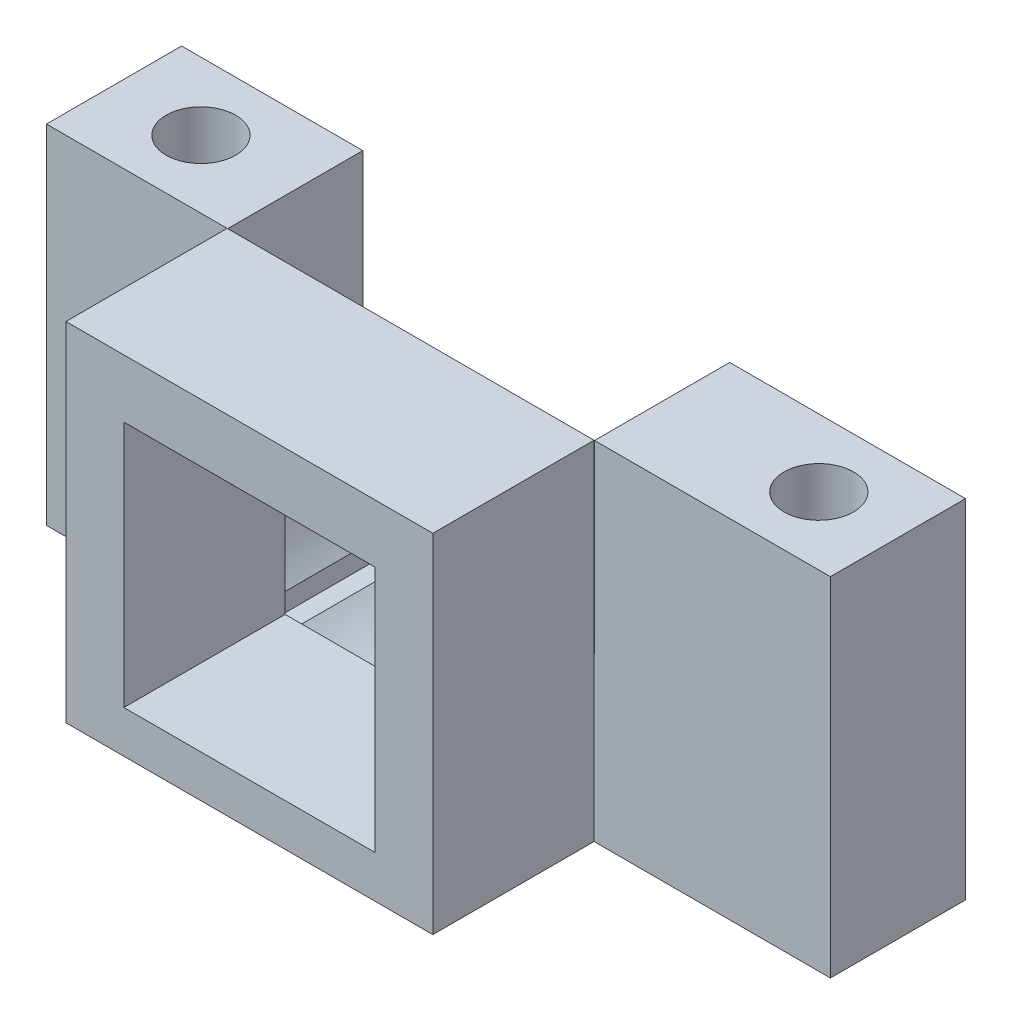
ISO-10303-21;
HEADER;
FILE_DESCRIPTION(('STEP AP214'),'2;1');
FILE_NAME('part.step','',(''),(''),'','','');
FILE_SCHEMA(('AUTOMOTIVE_DESIGN { 1 0 10303 214 1 1 1 1 }'));
ENDSEC;
DATA;
#1=APPLICATION_CONTEXT('core data for automotive mechanical design processes');
#2=APPLICATION_PROTOCOL_DEFINITION('international standard','automotive_design',2000,#1);
#3=PRODUCT_CONTEXT('',#1,'mechanical');
#4=PRODUCT('Part','Part','',(#3));
#5=PRODUCT_RELATED_PRODUCT_CATEGORY('part','',(#4));
#6=PRODUCT_DEFINITION_FORMATION('','',#4);
#7=PRODUCT_DEFINITION_CONTEXT('part definition',#1,'design');
#8=PRODUCT_DEFINITION('design','',#6,#7);
#9=PRODUCT_DEFINITION_SHAPE('','',#8);
#10=(LENGTH_UNIT() NAMED_UNIT(*) SI_UNIT(.MILLI.,.METRE.));
#11=(NAMED_UNIT(*) PLANE_ANGLE_UNIT() SI_UNIT($,.RADIAN.));
#12=(NAMED_UNIT(*) SI_UNIT($,.STERADIAN.) SOLID_ANGLE_UNIT());
#13=UNCERTAINTY_MEASURE_WITH_UNIT(LENGTH_MEASURE(1.E-05),#10,'distance_accuracy_value','');
#14=(GEOMETRIC_REPRESENTATION_CONTEXT(3) GLOBAL_UNCERTAINTY_ASSIGNED_CONTEXT((#13)) GLOBAL_UNIT_ASSIGNED_CONTEXT((#10,
#11,#12)) REPRESENTATION_CONTEXT('',''));
#15=CARTESIAN_POINT('',(0.,0.,0.));
#16=DIRECTION('',(0.,0.,1.));
#17=DIRECTION('',(1.,0.,0.));
#18=AXIS2_PLACEMENT_3D('',#15,#16,#17);
#19=CARTESIAN_POINT('',(18.3887402922752,10.3631468182852,7.));
#20=DIRECTION('',(0.,0.,-1.));
#21=DIRECTION('',(-1.,0.,0.));
#22=AXIS2_PLACEMENT_3D('',#19,#20,#21);
#23=CYLINDRICAL_SURFACE('',#22,8.75000000000001);
#24=CARTESIAN_POINT('',(18.3887402922752,10.3631468182852,0.));
#25=DIRECTION('',(0.,0.,1.));
#26=DIRECTION('',(1.,0.,0.));
#27=AXIS2_PLACEMENT_3D('',#24,#25,#26);
#28=CIRCLE('',#27,8.75000000000001);
#29=CARTESIAN_POINT('',(9.64212979628884,10.1196209849502,0.));
#30=VERTEX_POINT('',#29);
#31=CARTESIAN_POINT('',(11.6843212547284,4.7405793114446,0.));
#32=VERTEX_POINT('',#31);
#33=EDGE_CURVE('E292',#30,#32,#28,.T.);
#34=ORIENTED_EDGE('',*,*,#33,.F.);
#35=DIRECTION('',(0.,0.,-1.));
#36=VECTOR('',#35,1.);
#37=CARTESIAN_POINT('',(9.64212979628884,10.1196209849502,7.));
#38=LINE('',#37,#36);
#39=CARTESIAN_POINT('',(9.64212979628884,10.1196209849502,7.));
#40=VERTEX_POINT('',#39);
#41=EDGE_CURVE('E11',#40,#30,#38,.T.);
#42=ORIENTED_EDGE('',*,*,#41,.F.);
#43=CARTESIAN_POINT('',(18.3887402922752,10.3631468182852,7.));
#44=DIRECTION('',(0.,0.,1.));
#45=DIRECTION('',(1.,0.,0.));
#46=AXIS2_PLACEMENT_3D('',#43,#44,#45);
#47=CIRCLE('',#46,8.75000000000001);
#48=CARTESIAN_POINT('',(11.6843212547284,4.7405793114446,7.));
#49=VERTEX_POINT('',#48);
#50=EDGE_CURVE('E293',#40,#49,#47,.T.);
#51=ORIENTED_EDGE('',*,*,#50,.T.);
#52=DIRECTION('',(0.,0.,-1.));
#53=VECTOR('',#52,1.);
#54=CARTESIAN_POINT('',(11.6843212547284,4.7405793114446,7.));
#55=LINE('',#54,#53);
#56=EDGE_CURVE('E324',#49,#32,#55,.T.);
#57=ORIENTED_EDGE('',*,*,#56,.T.);
#58=EDGE_LOOP('',(#34,#42,#51,#57));
#59=FACE_BOUND('',#58,.T.);
#60=ADVANCED_FACE('F47',(#59),#23,.F.);
#61=CARTESIAN_POINT('',(0.,10.1196209849502,7.));
#62=DIRECTION('',(0.,1.,0.));
#63=DIRECTION('',(0.,0.,1.));
#64=AXIS2_PLACEMENT_3D('',#61,#62,#63);
#65=PLANE('',#64);
#66=DIRECTION('',(1.,0.,0.));
#67=VECTOR('',#66,1.);
#68=CARTESIAN_POINT('',(0.,10.1196209849502,0.));
#69=LINE('',#68,#67);
#70=CARTESIAN_POINT('',(8.88432125472841,10.1196209849502,0.));
#71=VERTEX_POINT('',#70);
#72=EDGE_CURVE('E328',#71,#30,#69,.T.);
#73=ORIENTED_EDGE('',*,*,#72,.F.);
#74=DIRECTION('',(0.,0.,-1.));
#75=VECTOR('',#74,1.);
#76=CARTESIAN_POINT('',(8.88432125472841,10.1196209849502,7.));
#77=LINE('',#76,#75);
#78=CARTESIAN_POINT('',(8.88432125472841,10.1196209849502,7.));
#79=VERTEX_POINT('',#78);
#80=EDGE_CURVE('E56',#79,#71,#77,.T.);
#81=ORIENTED_EDGE('',*,*,#80,.F.);
#82=DIRECTION('',(1.,0.,0.));
#83=VECTOR('',#82,1.);
#84=CARTESIAN_POINT('',(0.,10.1196209849502,7.));
#85=LINE('',#84,#83);
#86=EDGE_CURVE('E297',#79,#40,#85,.T.);
#87=ORIENTED_EDGE('',*,*,#86,.T.);
#88=ORIENTED_EDGE('',*,*,#41,.T.);
#89=EDGE_LOOP('',(#73,#81,#87,#88));
#90=FACE_BOUND('',#89,.T.);
#91=ADVANCED_FACE('F49',(#90),#65,.T.);
#92=CARTESIAN_POINT('',(8.88432125472841,0.,7.));
#93=DIRECTION('',(1.,0.,0.));
#94=DIRECTION('',(0.,0.,-1.));
#95=AXIS2_PLACEMENT_3D('',#92,#93,#94);
#96=PLANE('',#95);
#97=DIRECTION('',(0.,-1.,0.));
#98=VECTOR('',#97,1.);
#99=CARTESIAN_POINT('',(8.88432125472841,0.,0.));
#100=LINE('',#99,#98);
#101=CARTESIAN_POINT('',(8.88432125472841,19.7,0.));
#102=VERTEX_POINT('',#101);
#103=EDGE_CURVE('E333',#102,#71,#100,.T.);
#104=ORIENTED_EDGE('',*,*,#103,.F.);
#105=DIRECTION('',(0.,0.,-1.));
#106=VECTOR('',#105,1.);
#107=CARTESIAN_POINT('',(8.88432125472841,19.7,7.));
#108=LINE('',#107,#106);
#109=CARTESIAN_POINT('',(8.88432125472841,19.7,7.));
#110=VERTEX_POINT('',#109);
#111=EDGE_CURVE('E371',#110,#102,#108,.T.);
#112=ORIENTED_EDGE('',*,*,#111,.F.);
#113=DIRECTION('',(0.,-1.,0.));
#114=VECTOR('',#113,1.);
#115=CARTESIAN_POINT('',(8.88432125472841,0.,7.));
#116=LINE('',#115,#114);
#117=EDGE_CURVE('E303',#110,#79,#116,.T.);
#118=ORIENTED_EDGE('',*,*,#117,.T.);
#119=ORIENTED_EDGE('',*,*,#80,.T.);
#120=EDGE_LOOP('',(#104,#112,#118,#119));
#121=FACE_BOUND('',#120,.T.);
#122=ADVANCED_FACE('F377',(#121),#96,.T.);
#123=CARTESIAN_POINT('',(0.,19.7,7.));
#124=DIRECTION('',(0.,1.,0.));
#125=DIRECTION('',(0.,0.,1.));
#126=AXIS2_PLACEMENT_3D('',#123,#124,#125);
#127=PLANE('',#126);
#128=CARTESIAN_POINT('',(4.,19.7,3.5));
#129=DIRECTION('',(0.,1.,0.));
#130=DIRECTION('',(0.,0.,1.));
#131=AXIS2_PLACEMENT_3D('',#128,#129,#130);
#132=CIRCLE('',#131,1.8);
#133=CARTESIAN_POINT('',(4.,19.7,5.3));
#134=VERTEX_POINT('',#133);
#135=EDGE_CURVE('E544',#134,#134,#132,.T.);
#136=ORIENTED_EDGE('',*,*,#135,.F.);
#137=EDGE_LOOP('',(#136));
#138=FACE_BOUND('',#137,.T.);
#139=DIRECTION('',(1.,0.,0.));
#140=VECTOR('',#139,1.);
#141=CARTESIAN_POINT('',(0.,19.7,0.));
#142=LINE('',#141,#140);
#143=CARTESIAN_POINT('',(-0.5,19.7,0.));
#144=VERTEX_POINT('',#143);
#145=EDGE_CURVE('E337',#144,#102,#142,.T.);
#146=ORIENTED_EDGE('',*,*,#145,.F.);
#147=DIRECTION('',(0.,0.,-1.));
#148=VECTOR('',#147,1.);
#149=CARTESIAN_POINT('',(-0.5,19.7,7.));
#150=LINE('',#149,#148);
#151=CARTESIAN_POINT('',(-0.5,19.7,7.));
#152=VERTEX_POINT('',#151);
#153=EDGE_CURVE('E368',#152,#144,#150,.T.);
#154=ORIENTED_EDGE('',*,*,#153,.F.);
#155=DIRECTION('',(1.,0.,0.));
#156=VECTOR('',#155,1.);
#157=CARTESIAN_POINT('',(0.,19.7,7.));
#158=LINE('',#157,#156);
#159=CARTESIAN_POINT('',(8.86,19.7,7.));
#160=VERTEX_POINT('',#159);
#161=EDGE_CURVE('E307',#152,#160,#158,.T.);
#162=ORIENTED_EDGE('',*,*,#161,.T.);
#163=DIRECTION('',(0.,0.,-1.));
#164=VECTOR('',#163,1.);
#165=CARTESIAN_POINT('',(8.86,19.7,15.35));
#166=LINE('',#165,#164);
#167=CARTESIAN_POINT('',(8.86,19.7,15.35));
#168=VERTEX_POINT('',#167);
#169=EDGE_CURVE('E275',#168,#160,#166,.T.);
#170=ORIENTED_EDGE('',*,*,#169,.F.);
#171=DIRECTION('',(-1.,0.,0.));
#172=VECTOR('',#171,1.);
#173=CARTESIAN_POINT('',(8.86,19.7,15.35));
#174=LINE('',#173,#172);
#175=CARTESIAN_POINT('',(27.8603974424949,19.7,15.35));
#176=VERTEX_POINT('',#175);
#177=EDGE_CURVE('E280',#176,#168,#174,.T.);
#178=ORIENTED_EDGE('',*,*,#177,.F.);
#179=DIRECTION('',(0.,0.,-1.));
#180=VECTOR('',#179,1.);
#181=CARTESIAN_POINT('',(27.8603974424949,19.7,15.35));
#182=LINE('',#181,#180);
#183=CARTESIAN_POINT('',(27.8603974424949,19.7,7.));
#184=VERTEX_POINT('',#183);
#185=EDGE_CURVE('E279',#176,#184,#182,.T.);
#186=ORIENTED_EDGE('',*,*,#185,.T.);
#187=DIRECTION('',(-1.,0.,0.));
#188=VECTOR('',#187,1.);
#189=CARTESIAN_POINT('',(8.86,19.7,7.));
#190=LINE('',#189,#188);
#191=EDGE_CURVE('E270',#184,#110,#190,.T.);
#192=ORIENTED_EDGE('',*,*,#191,.T.);
#193=ORIENTED_EDGE('',*,*,#111,.T.);
#194=EDGE_LOOP('',(#146,#154,#162,#170,#178,#186,#192,#193));
#195=FACE_BOUND('',#194,.T.);
#196=ADVANCED_FACE('F388',(#138,#195),#127,.T.);
#197=CARTESIAN_POINT('',(-0.5,0.,7.));
#198=DIRECTION('',(1.,0.,0.));
#199=DIRECTION('',(0.,0.,-1.));
#200=AXIS2_PLACEMENT_3D('',#197,#198,#199);
#201=PLANE('',#200);
#202=DIRECTION('',(0.,-1.,0.));
#203=VECTOR('',#202,1.);
#204=CARTESIAN_POINT('',(-0.5,0.,0.));
#205=LINE('',#204,#203);
#206=CARTESIAN_POINT('',(-0.5,1.7,0.));
#207=VERTEX_POINT('',#206);
#208=EDGE_CURVE('E341',#144,#207,#205,.T.);
#209=ORIENTED_EDGE('',*,*,#208,.T.);
#210=DIRECTION('',(0.,0.,-1.));
#211=VECTOR('',#210,1.);
#212=CARTESIAN_POINT('',(-0.5,1.7,7.));
#213=LINE('',#212,#211);
#214=CARTESIAN_POINT('',(-0.5,1.7,7.));
#215=VERTEX_POINT('',#214);
#216=EDGE_CURVE('E364',#215,#207,#213,.T.);
#217=ORIENTED_EDGE('',*,*,#216,.F.);
#218=DIRECTION('',(0.,-1.,0.));
#219=VECTOR('',#218,1.);
#220=CARTESIAN_POINT('',(-0.5,0.,7.));
#221=LINE('',#220,#219);
#222=EDGE_CURVE('E310',#152,#215,#221,.T.);
#223=ORIENTED_EDGE('',*,*,#222,.F.);
#224=ORIENTED_EDGE('',*,*,#153,.T.);
#225=EDGE_LOOP('',(#209,#217,#223,#224));
#226=FACE_BOUND('',#225,.T.);
#227=ADVANCED_FACE('F562',(#226),#201,.F.);
#228=CARTESIAN_POINT('',(0.,1.7,7.));
#229=DIRECTION('',(0.,1.,0.));
#230=DIRECTION('',(-1.,0.,0.));
#231=AXIS2_PLACEMENT_3D('',#228,#229,#230);
#232=PLANE('',#231);
#233=CARTESIAN_POINT('',(4.,1.7,3.5));
#234=DIRECTION('',(0.,1.,0.));
#235=DIRECTION('',(0.,0.,1.));
#236=AXIS2_PLACEMENT_3D('',#233,#234,#235);
#237=CIRCLE('',#236,1.8);
#238=CARTESIAN_POINT('',(4.,1.7,5.3));
#239=VERTEX_POINT('',#238);
#240=EDGE_CURVE('E513',#239,#239,#237,.T.);
#241=ORIENTED_EDGE('',*,*,#240,.T.);
#242=EDGE_LOOP('',(#241));
#243=FACE_BOUND('',#242,.T.);
#244=CARTESIAN_POINT('',(36.,1.7,3.5));
#245=DIRECTION('',(0.,1.,0.));
#246=DIRECTION('',(0.,0.,1.));
#247=AXIS2_PLACEMENT_3D('',#244,#245,#246);
#248=CIRCLE('',#247,1.8);
#249=CARTESIAN_POINT('',(36.,1.7,5.3));
#250=VERTEX_POINT('',#249);
#251=EDGE_CURVE('E536',#250,#250,#248,.T.);
#252=ORIENTED_EDGE('',*,*,#251,.T.);
#253=EDGE_LOOP('',(#252));
#254=FACE_BOUND('',#253,.T.);
#255=DIRECTION('',(1.,0.,0.));
#256=VECTOR('',#255,1.);
#257=CARTESIAN_POINT('',(0.,1.7,0.));
#258=LINE('',#257,#256);
#259=CARTESIAN_POINT('',(17.1589487632613,1.7,0.));
#260=VERTEX_POINT('',#259);
#261=EDGE_CURVE('E344',#207,#260,#258,.T.);
#262=ORIENTED_EDGE('',*,*,#261,.T.);
#263=DIRECTION('',(0.,0.,-1.));
#264=VECTOR('',#263,1.);
#265=CARTESIAN_POINT('',(17.1589487632613,1.7,7.));
#266=LINE('',#265,#264);
#267=CARTESIAN_POINT('',(17.1589487632613,1.7,7.));
#268=VERTEX_POINT('',#267);
#269=EDGE_CURVE('E255',#268,#260,#266,.T.);
#270=ORIENTED_EDGE('',*,*,#269,.F.);
#271=DIRECTION('',(1.,0.,0.));
#272=VECTOR('',#271,1.);
#273=CARTESIAN_POINT('',(8.86,1.70000000000001,7.));
#274=LINE('',#273,#272);
#275=CARTESIAN_POINT('',(19.6185318212891,1.7,7.));
#276=VERTEX_POINT('',#275);
#277=EDGE_CURVE('E244',#268,#276,#274,.T.);
#278=ORIENTED_EDGE('',*,*,#277,.T.);
#279=DIRECTION('',(0.,0.,-1.));
#280=VECTOR('',#279,1.);
#281=CARTESIAN_POINT('',(19.6185318212891,1.7,7.));
#282=LINE('',#281,#280);
#283=CARTESIAN_POINT('',(19.6185318212891,1.7,0.));
#284=VERTEX_POINT('',#283);
#285=EDGE_CURVE('E224',#276,#284,#282,.T.);
#286=ORIENTED_EDGE('',*,*,#285,.T.);
#287=DIRECTION('',(1.,0.,0.));
#288=VECTOR('',#287,1.);
#289=CARTESIAN_POINT('',(0.,1.7,0.));
#290=LINE('',#289,#288);
#291=CARTESIAN_POINT('',(40.1,1.7,0.));
#292=VERTEX_POINT('',#291);
#293=EDGE_CURVE('E508',#284,#292,#290,.T.);
#294=ORIENTED_EDGE('',*,*,#293,.T.);
#295=DIRECTION('',(0.,0.,-1.));
#296=VECTOR('',#295,1.);
#297=CARTESIAN_POINT('',(40.1,1.7,7.));
#298=LINE('',#297,#296);
#299=CARTESIAN_POINT('',(40.1,1.7,7.));
#300=VERTEX_POINT('',#299);
#301=EDGE_CURVE('E237',#300,#292,#298,.T.);
#302=ORIENTED_EDGE('',*,*,#301,.F.);
#303=DIRECTION('',(1.,0.,0.));
#304=VECTOR('',#303,1.);
#305=CARTESIAN_POINT('',(0.,1.7,7.));
#306=LINE('',#305,#304);
#307=CARTESIAN_POINT('',(27.8603974424949,1.7,7.));
#308=VERTEX_POINT('',#307);
#309=EDGE_CURVE('E249',#308,#300,#306,.T.);
#310=ORIENTED_EDGE('',*,*,#309,.F.);
#311=DIRECTION('',(0.,0.,-1.));
#312=VECTOR('',#311,1.);
#313=CARTESIAN_POINT('',(27.8603974424949,1.70000000000001,15.35));
#314=LINE('',#313,#312);
#315=CARTESIAN_POINT('',(27.8603974424949,1.70000000000001,15.35));
#316=VERTEX_POINT('',#315);
#317=EDGE_CURVE('E284',#316,#308,#314,.T.);
#318=ORIENTED_EDGE('',*,*,#317,.F.);
#319=DIRECTION('',(1.,0.,0.));
#320=VECTOR('',#319,1.);
#321=CARTESIAN_POINT('',(8.86,1.70000000000001,15.35));
#322=LINE('',#321,#320);
#323=CARTESIAN_POINT('',(8.86,1.70000000000001,15.35));
#324=VERTEX_POINT('',#323);
#325=EDGE_CURVE('E410',#324,#316,#322,.T.);
#326=ORIENTED_EDGE('',*,*,#325,.F.);
#327=DIRECTION('',(0.,0.,-1.));
#328=VECTOR('',#327,1.);
#329=CARTESIAN_POINT('',(8.86,1.70000000000001,15.35));
#330=LINE('',#329,#328);
#331=CARTESIAN_POINT('',(8.86,1.70000000000001,7.));
#332=VERTEX_POINT('',#331);
#333=EDGE_CURVE('E288',#324,#332,#330,.T.);
#334=ORIENTED_EDGE('',*,*,#333,.T.);
#335=DIRECTION('',(1.,0.,0.));
#336=VECTOR('',#335,1.);
#337=CARTESIAN_POINT('',(0.,1.7,7.));
#338=LINE('',#337,#336);
#339=EDGE_CURVE('E313',#215,#332,#338,.T.);
#340=ORIENTED_EDGE('',*,*,#339,.F.);
#341=ORIENTED_EDGE('',*,*,#216,.T.);
#342=EDGE_LOOP('',(#262,#270,#278,#286,#294,#302,#310,#318,#326,#334,#340,#341));
#343=FACE_BOUND('',#342,.T.);
#344=ADVANCED_FACE('F254',(#243,#254,#343),#232,.F.);
#345=CARTESIAN_POINT('',(12.6181265718274,3.78572199626109,0.));
#346=VERTEX_POINT('',#345);
#347=EDGE_CURVE('E329',#346,#260,#28,.T.);
#348=ORIENTED_EDGE('',*,*,#347,.F.);
#349=DIRECTION('',(0.,0.,-1.));
#350=VECTOR('',#349,1.);
#351=CARTESIAN_POINT('',(12.6181265718274,3.78572199626109,7.));
#352=LINE('',#351,#350);
#353=CARTESIAN_POINT('',(12.6181265718274,3.78572199626109,7.));
#354=VERTEX_POINT('',#353);
#355=EDGE_CURVE('E359',#354,#346,#352,.T.);
#356=ORIENTED_EDGE('',*,*,#355,.F.);
#357=EDGE_CURVE('E299',#354,#268,#47,.T.);
#358=ORIENTED_EDGE('',*,*,#357,.T.);
#359=ORIENTED_EDGE('',*,*,#269,.T.);
#360=EDGE_LOOP('',(#348,#356,#358,#359));
#361=FACE_BOUND('',#360,.T.);
#362=ADVANCED_FACE('F574',(#361),#23,.F.);
#363=CARTESIAN_POINT('',(0.,3.78572199626109,7.));
#364=DIRECTION('',(0.,1.,0.));
#365=DIRECTION('',(0.,0.,1.));
#366=AXIS2_PLACEMENT_3D('',#363,#364,#365);
#367=PLANE('',#366);
#368=DIRECTION('',(1.,0.,0.));
#369=VECTOR('',#368,1.);
#370=CARTESIAN_POINT('',(0.,3.78572199626109,0.));
#371=LINE('',#370,#369);
#372=CARTESIAN_POINT('',(11.6843212547284,3.78572199626109,0.));
#373=VERTEX_POINT('',#372);
#374=EDGE_CURVE('E347',#373,#346,#371,.T.);
#375=ORIENTED_EDGE('',*,*,#374,.F.);
#376=DIRECTION('',(0.,0.,-1.));
#377=VECTOR('',#376,1.);
#378=CARTESIAN_POINT('',(11.6843212547284,3.78572199626109,7.));
#379=LINE('',#378,#377);
#380=CARTESIAN_POINT('',(11.6843212547284,3.78572199626109,7.));
#381=VERTEX_POINT('',#380);
#382=EDGE_CURVE('E356',#381,#373,#379,.T.);
#383=ORIENTED_EDGE('',*,*,#382,.F.);
#384=DIRECTION('',(1.,0.,0.));
#385=VECTOR('',#384,1.);
#386=CARTESIAN_POINT('',(0.,3.78572199626109,7.));
#387=LINE('',#386,#385);
#388=EDGE_CURVE('E316',#381,#354,#387,.T.);
#389=ORIENTED_EDGE('',*,*,#388,.T.);
#390=ORIENTED_EDGE('',*,*,#355,.T.);
#391=EDGE_LOOP('',(#375,#383,#389,#390));
#392=FACE_BOUND('',#391,.T.);
#393=ADVANCED_FACE('F401',(#392),#367,.T.);
#394=CARTESIAN_POINT('',(11.6843212547284,0.,7.));
#395=DIRECTION('',(1.,0.,0.));
#396=DIRECTION('',(0.,0.,-1.));
#397=AXIS2_PLACEMENT_3D('',#394,#395,#396);
#398=PLANE('',#397);
#399=DIRECTION('',(0.,-1.,0.));
#400=VECTOR('',#399,1.);
#401=CARTESIAN_POINT('',(11.6843212547284,0.,0.));
#402=LINE('',#401,#400);
#403=EDGE_CURVE('E298',#32,#373,#402,.T.);
#404=ORIENTED_EDGE('',*,*,#403,.F.);
#405=ORIENTED_EDGE('',*,*,#56,.F.);
#406=DIRECTION('',(0.,-1.,0.));
#407=VECTOR('',#406,1.);
#408=CARTESIAN_POINT('',(11.6843212547284,0.,7.));
#409=LINE('',#408,#407);
#410=EDGE_CURVE('E320',#49,#381,#409,.T.);
#411=ORIENTED_EDGE('',*,*,#410,.T.);
#412=ORIENTED_EDGE('',*,*,#382,.T.);
#413=EDGE_LOOP('',(#404,#405,#411,#412));
#414=FACE_BOUND('',#413,.T.);
#415=ADVANCED_FACE('F398',(#414),#398,.T.);
#416=CARTESIAN_POINT('',(0.,0.,7.));
#417=DIRECTION('',(0.,0.,1.));
#418=DIRECTION('',(1.,0.,0.));
#419=AXIS2_PLACEMENT_3D('',#416,#417,#418);
#420=PLANE('',#419);
#421=DIRECTION('',(0.,-1.,0.));
#422=VECTOR('',#421,1.);
#423=CARTESIAN_POINT('',(8.86,19.7,7.));
#424=LINE('',#423,#422);
#425=EDGE_CURVE('E71',#160,#332,#424,.T.);
#426=ORIENTED_EDGE('',*,*,#425,.F.);
#427=ORIENTED_EDGE('',*,*,#161,.F.);
#428=ORIENTED_EDGE('',*,*,#222,.T.);
#429=ORIENTED_EDGE('',*,*,#339,.T.);
#430=EDGE_LOOP('',(#426,#427,#428,#429));
#431=FACE_BOUND('',#430,.T.);
#432=ADVANCED_FACE('F772',(#431),#420,.T.);
#433=CARTESIAN_POINT('',(0.,0.,0.));
#434=DIRECTION('',(0.,0.,1.));
#435=DIRECTION('',(1.,0.,0.));
#436=AXIS2_PLACEMENT_3D('',#433,#434,#435);
#437=PLANE('',#436);
#438=ORIENTED_EDGE('',*,*,#33,.T.);
#439=ORIENTED_EDGE('',*,*,#403,.T.);
#440=ORIENTED_EDGE('',*,*,#374,.T.);
#441=ORIENTED_EDGE('',*,*,#347,.T.);
#442=ORIENTED_EDGE('',*,*,#261,.F.);
#443=ORIENTED_EDGE('',*,*,#208,.F.);
#444=ORIENTED_EDGE('',*,*,#145,.T.);
#445=ORIENTED_EDGE('',*,*,#103,.T.);
#446=ORIENTED_EDGE('',*,*,#72,.T.);
#447=EDGE_LOOP('',(#438,#439,#440,#441,#442,#443,#444,#445,#446));
#448=FACE_BOUND('',#447,.T.);
#449=ADVANCED_FACE('F383',(#448),#437,.F.);
#450=CARTESIAN_POINT('',(0.,0.,15.35));
#451=DIRECTION('',(0.,0.,1.));
#452=DIRECTION('',(1.,0.,0.));
#453=AXIS2_PLACEMENT_3D('',#450,#451,#452);
#454=PLANE('',#453);
#455=DIRECTION('',(0.,-1.,0.));
#456=VECTOR('',#455,1.);
#457=CARTESIAN_POINT('',(8.86,19.7,15.35));
#458=LINE('',#457,#456);
#459=EDGE_CURVE('E274',#168,#324,#458,.T.);
#460=ORIENTED_EDGE('',*,*,#459,.T.);
#461=ORIENTED_EDGE('',*,*,#325,.T.);
#462=DIRECTION('',(0.,1.,0.));
#463=VECTOR('',#462,1.);
#464=CARTESIAN_POINT('',(27.8603974424949,19.7,15.35));
#465=LINE('',#464,#463);
#466=EDGE_CURVE('E408',#316,#176,#465,.T.);
#467=ORIENTED_EDGE('',*,*,#466,.T.);
#468=ORIENTED_EDGE('',*,*,#177,.T.);
#469=EDGE_LOOP('',(#460,#461,#467,#468));
#470=FACE_BOUND('',#469,.T.);
#471=DIRECTION('',(1.,0.,0.));
#472=VECTOR('',#471,1.);
#473=CARTESIAN_POINT('',(11.8603974424954,3.88746318309419,15.35));
#474=LINE('',#473,#472);
#475=CARTESIAN_POINT('',(11.8603974424954,3.88746318309419,15.35));
#476=VERTEX_POINT('',#475);
#477=CARTESIAN_POINT('',(24.8603974424949,3.88746318309419,15.35));
#478=VERTEX_POINT('',#477);
#479=EDGE_CURVE('E456',#476,#478,#474,.T.);
#480=ORIENTED_EDGE('',*,*,#479,.F.);
#481=DIRECTION('',(0.,-1.,0.));
#482=VECTOR('',#481,1.);
#483=CARTESIAN_POINT('',(11.8603974424954,16.6874631830942,15.35));
#484=LINE('',#483,#482);
#485=CARTESIAN_POINT('',(11.8603974424954,16.6874631830942,15.35));
#486=VERTEX_POINT('',#485);
#487=EDGE_CURVE('E438',#486,#476,#484,.T.);
#488=ORIENTED_EDGE('',*,*,#487,.F.);
#489=DIRECTION('',(-1.,0.,0.));
#490=VECTOR('',#489,1.);
#491=CARTESIAN_POINT('',(11.8603974424954,16.6874631830942,15.35));
#492=LINE('',#491,#490);
#493=CARTESIAN_POINT('',(24.8603974424949,16.6874631830942,15.35));
#494=VERTEX_POINT('',#493);
#495=EDGE_CURVE('E433',#494,#486,#492,.T.);
#496=ORIENTED_EDGE('',*,*,#495,.F.);
#497=DIRECTION('',(0.,1.,0.));
#498=VECTOR('',#497,1.);
#499=CARTESIAN_POINT('',(24.8603974424949,16.6874631830942,15.35));
#500=LINE('',#499,#498);
#501=EDGE_CURVE('E452',#478,#494,#500,.T.);
#502=ORIENTED_EDGE('',*,*,#501,.F.);
#503=EDGE_LOOP('',(#480,#488,#496,#502));
#504=FACE_BOUND('',#503,.T.);
#505=ADVANCED_FACE('F679',(#470,#504),#454,.T.);
#506=CARTESIAN_POINT('',(0.,0.,7.));
#507=DIRECTION('',(0.,0.,1.));
#508=DIRECTION('',(1.,0.,0.));
#509=AXIS2_PLACEMENT_3D('',#506,#507,#508);
#510=PLANE('',#509);
#511=DIRECTION('',(1.,0.,0.));
#512=VECTOR('',#511,1.);
#513=CARTESIAN_POINT('',(0.,3.78572199626109,7.));
#514=LINE('',#513,#512);
#515=CARTESIAN_POINT('',(24.159354012723,3.78572199626109,7.));
#516=VERTEX_POINT('',#515);
#517=CARTESIAN_POINT('',(25.0843212547284,3.78572199626109,7.));
#518=VERTEX_POINT('',#517);
#519=EDGE_CURVE('E247',#516,#518,#514,.T.);
#520=ORIENTED_EDGE('',*,*,#519,.F.);
#521=CARTESIAN_POINT('',(18.3887402922752,10.3631468182852,7.));
#522=DIRECTION('',(0.,0.,1.));
#523=DIRECTION('',(1.,0.,0.));
#524=AXIS2_PLACEMENT_3D('',#521,#522,#523);
#525=CIRCLE('',#524,8.75000000000001);
#526=EDGE_CURVE('E227',#276,#516,#525,.T.);
#527=ORIENTED_EDGE('',*,*,#526,.F.);
#528=ORIENTED_EDGE('',*,*,#277,.F.);
#529=ORIENTED_EDGE('',*,*,#357,.F.);
#530=ORIENTED_EDGE('',*,*,#388,.F.);
#531=ORIENTED_EDGE('',*,*,#410,.F.);
#532=ORIENTED_EDGE('',*,*,#50,.F.);
#533=ORIENTED_EDGE('',*,*,#86,.F.);
#534=ORIENTED_EDGE('',*,*,#117,.F.);
#535=ORIENTED_EDGE('',*,*,#191,.F.);
#536=DIRECTION('',(0.,1.,0.));
#537=VECTOR('',#536,1.);
#538=CARTESIAN_POINT('',(27.8603974424949,19.7,7.));
#539=LINE('',#538,#537);
#540=CARTESIAN_POINT('',(27.8603974424949,10.1196209849502,7.));
#541=VERTEX_POINT('',#540);
#542=EDGE_CURVE('E258',#541,#184,#539,.T.);
#543=ORIENTED_EDGE('',*,*,#542,.F.);
#544=DIRECTION('',(1.,0.,0.));
#545=VECTOR('',#544,1.);
#546=CARTESIAN_POINT('',(0.,10.1196209849502,7.));
#547=LINE('',#546,#545);
#548=CARTESIAN_POINT('',(27.1353507882615,10.1196209849502,7.));
#549=VERTEX_POINT('',#548);
#550=EDGE_CURVE('E63',#549,#541,#547,.T.);
#551=ORIENTED_EDGE('',*,*,#550,.F.);
#552=CARTESIAN_POINT('',(25.0843212547284,4.73005747270991,7.));
#553=VERTEX_POINT('',#552);
#554=EDGE_CURVE('E252',#553,#549,#525,.T.);
#555=ORIENTED_EDGE('',*,*,#554,.F.);
#556=DIRECTION('',(0.,-1.,0.));
#557=VECTOR('',#556,1.);
#558=CARTESIAN_POINT('',(25.0843212547284,0.,7.));
#559=LINE('',#558,#557);
#560=EDGE_CURVE('E516',#553,#518,#559,.T.);
#561=ORIENTED_EDGE('',*,*,#560,.T.);
#562=EDGE_LOOP('',(#520,#527,#528,#529,#530,#531,#532,#533,#534,#535,#543,#551,#555,#561));
#563=FACE_BOUND('',#562,.T.);
#564=DIRECTION('',(0.,-1.,0.));
#565=VECTOR('',#564,1.);
#566=CARTESIAN_POINT('',(11.8603974424954,16.6874631830942,7.));
#567=LINE('',#566,#565);
#568=CARTESIAN_POINT('',(11.8603974424954,16.6874631830942,7.));
#569=VERTEX_POINT('',#568);
#570=CARTESIAN_POINT('',(11.8603974424954,3.88746318309419,7.));
#571=VERTEX_POINT('',#570);
#572=EDGE_CURVE('E236',#569,#571,#567,.T.);
#573=ORIENTED_EDGE('',*,*,#572,.T.);
#574=DIRECTION('',(1.,0.,0.));
#575=VECTOR('',#574,1.);
#576=CARTESIAN_POINT('',(11.8603974424954,3.88746318309419,7.));
#577=LINE('',#576,#575);
#578=CARTESIAN_POINT('',(24.8603974424949,3.88746318309419,7.));
#579=VERTEX_POINT('',#578);
#580=EDGE_CURVE('E443',#571,#579,#577,.T.);
#581=ORIENTED_EDGE('',*,*,#580,.T.);
#582=DIRECTION('',(0.,1.,0.));
#583=VECTOR('',#582,1.);
#584=CARTESIAN_POINT('',(24.8603974424949,16.6874631830942,7.));
#585=LINE('',#584,#583);
#586=CARTESIAN_POINT('',(24.8603974424949,16.6874631830942,7.));
#587=VERTEX_POINT('',#586);
#588=EDGE_CURVE('E439',#579,#587,#585,.T.);
#589=ORIENTED_EDGE('',*,*,#588,.T.);
#590=DIRECTION('',(-1.,0.,0.));
#591=VECTOR('',#590,1.);
#592=CARTESIAN_POINT('',(11.8603974424954,16.6874631830942,7.));
#593=LINE('',#592,#591);
#594=EDGE_CURVE('E434',#587,#569,#593,.T.);
#595=ORIENTED_EDGE('',*,*,#594,.T.);
#596=EDGE_LOOP('',(#573,#581,#589,#595));
#597=FACE_BOUND('',#596,.T.);
#598=ADVANCED_FACE('F241',(#563,#597),#510,.F.);
#599=CARTESIAN_POINT('',(8.86,19.7,15.35));
#600=DIRECTION('',(1.,0.,0.));
#601=DIRECTION('',(0.,1.,0.));
#602=AXIS2_PLACEMENT_3D('',#599,#600,#601);
#603=PLANE('',#602);
#604=ORIENTED_EDGE('',*,*,#425,.T.);
#605=ORIENTED_EDGE('',*,*,#333,.F.);
#606=ORIENTED_EDGE('',*,*,#459,.F.);
#607=ORIENTED_EDGE('',*,*,#169,.T.);
#608=EDGE_LOOP('',(#604,#605,#606,#607));
#609=FACE_BOUND('',#608,.T.);
#610=ADVANCED_FACE('F662',(#609),#603,.F.);
#611=CARTESIAN_POINT('',(27.8603974424949,19.7,15.35));
#612=DIRECTION('',(-1.,0.,0.));
#613=DIRECTION('',(0.,0.,1.));
#614=AXIS2_PLACEMENT_3D('',#611,#612,#613);
#615=PLANE('',#614);
#616=EDGE_CURVE('E262',#308,#541,#539,.T.);
#617=ORIENTED_EDGE('',*,*,#616,.T.);
#618=ORIENTED_EDGE('',*,*,#542,.T.);
#619=ORIENTED_EDGE('',*,*,#185,.F.);
#620=ORIENTED_EDGE('',*,*,#466,.F.);
#621=ORIENTED_EDGE('',*,*,#317,.T.);
#622=EDGE_LOOP('',(#617,#618,#619,#620,#621));
#623=FACE_BOUND('',#622,.T.);
#624=ADVANCED_FACE('F653',(#623),#615,.F.);
#625=CARTESIAN_POINT('',(11.8603974424954,16.6874631830942,15.35));
#626=DIRECTION('',(1.,0.,0.));
#627=DIRECTION('',(0.,1.,0.));
#628=AXIS2_PLACEMENT_3D('',#625,#626,#627);
#629=PLANE('',#628);
#630=ORIENTED_EDGE('',*,*,#572,.F.);
#631=DIRECTION('',(0.,0.,-1.));
#632=VECTOR('',#631,1.);
#633=CARTESIAN_POINT('',(11.8603974424954,16.6874631830942,15.35));
#634=LINE('',#633,#632);
#635=EDGE_CURVE('E429',#486,#569,#634,.T.);
#636=ORIENTED_EDGE('',*,*,#635,.F.);
#637=ORIENTED_EDGE('',*,*,#487,.T.);
#638=DIRECTION('',(0.,0.,-1.));
#639=VECTOR('',#638,1.);
#640=CARTESIAN_POINT('',(11.8603974424954,3.88746318309419,15.35));
#641=LINE('',#640,#639);
#642=EDGE_CURVE('E264',#476,#571,#641,.T.);
#643=ORIENTED_EDGE('',*,*,#642,.T.);
#644=EDGE_LOOP('',(#630,#636,#637,#643));
#645=FACE_BOUND('',#644,.T.);
#646=ADVANCED_FACE('F644',(#645),#629,.T.);
#647=CARTESIAN_POINT('',(11.8603974424954,3.88746318309419,15.35));
#648=DIRECTION('',(0.,1.,0.));
#649=DIRECTION('',(0.,0.,1.));
#650=AXIS2_PLACEMENT_3D('',#647,#648,#649);
#651=PLANE('',#650);
#652=ORIENTED_EDGE('',*,*,#580,.F.);
#653=ORIENTED_EDGE('',*,*,#642,.F.);
#654=ORIENTED_EDGE('',*,*,#479,.T.);
#655=DIRECTION('',(0.,0.,-1.));
#656=VECTOR('',#655,1.);
#657=CARTESIAN_POINT('',(24.8603974424949,3.88746318309419,15.35));
#658=LINE('',#657,#656);
#659=EDGE_CURVE('E423',#478,#579,#658,.T.);
#660=ORIENTED_EDGE('',*,*,#659,.T.);
#661=EDGE_LOOP('',(#652,#653,#654,#660));
#662=FACE_BOUND('',#661,.T.);
#663=ADVANCED_FACE('F635',(#662),#651,.T.);
#664=CARTESIAN_POINT('',(24.8603974424949,16.6874631830942,15.35));
#665=DIRECTION('',(-1.,0.,0.));
#666=DIRECTION('',(0.,0.,1.));
#667=AXIS2_PLACEMENT_3D('',#664,#665,#666);
#668=PLANE('',#667);
#669=ORIENTED_EDGE('',*,*,#588,.F.);
#670=ORIENTED_EDGE('',*,*,#659,.F.);
#671=ORIENTED_EDGE('',*,*,#501,.T.);
#672=DIRECTION('',(0.,0.,-1.));
#673=VECTOR('',#672,1.);
#674=CARTESIAN_POINT('',(24.8603974424949,16.6874631830942,15.35));
#675=LINE('',#674,#673);
#676=EDGE_CURVE('E426',#494,#587,#675,.T.);
#677=ORIENTED_EDGE('',*,*,#676,.T.);
#678=EDGE_LOOP('',(#669,#670,#671,#677));
#679=FACE_BOUND('',#678,.T.);
#680=ADVANCED_FACE('F626',(#679),#668,.T.);
#681=CARTESIAN_POINT('',(11.8603974424954,16.6874631830942,15.35));
#682=DIRECTION('',(0.,-1.,0.));
#683=DIRECTION('',(0.,0.,-1.));
#684=AXIS2_PLACEMENT_3D('',#681,#682,#683);
#685=PLANE('',#684);
#686=ORIENTED_EDGE('',*,*,#594,.F.);
#687=ORIENTED_EDGE('',*,*,#676,.F.);
#688=ORIENTED_EDGE('',*,*,#495,.T.);
#689=ORIENTED_EDGE('',*,*,#635,.T.);
#690=EDGE_LOOP('',(#686,#687,#688,#689));
#691=FACE_BOUND('',#690,.T.);
#692=ADVANCED_FACE('F621',(#691),#685,.T.);
#693=CARTESIAN_POINT('',(0.,0.,7.));
#694=DIRECTION('',(0.,0.,1.));
#695=DIRECTION('',(1.,0.,0.));
#696=AXIS2_PLACEMENT_3D('',#693,#694,#695);
#697=PLANE('',#696);
#698=ORIENTED_EDGE('',*,*,#616,.F.);
#699=ORIENTED_EDGE('',*,*,#309,.T.);
#700=DIRECTION('',(0.,-1.,0.));
#701=VECTOR('',#700,1.);
#702=CARTESIAN_POINT('',(40.1,0.,7.));
#703=LINE('',#702,#701);
#704=CARTESIAN_POINT('',(40.1,19.7,7.));
#705=VERTEX_POINT('',#704);
#706=EDGE_CURVE('E530',#705,#300,#703,.T.);
#707=ORIENTED_EDGE('',*,*,#706,.F.);
#708=DIRECTION('',(1.,0.,0.));
#709=VECTOR('',#708,1.);
#710=CARTESIAN_POINT('',(0.,19.7,7.));
#711=LINE('',#710,#709);
#712=CARTESIAN_POINT('',(27.8843212547284,19.7,7.));
#713=VERTEX_POINT('',#712);
#714=EDGE_CURVE('E526',#713,#705,#711,.T.);
#715=ORIENTED_EDGE('',*,*,#714,.F.);
#716=DIRECTION('',(0.,-1.,0.));
#717=VECTOR('',#716,1.);
#718=CARTESIAN_POINT('',(27.8843212547284,0.,7.));
#719=LINE('',#718,#717);
#720=CARTESIAN_POINT('',(27.8843212547284,10.1196209849502,7.));
#721=VERTEX_POINT('',#720);
#722=EDGE_CURVE('E522',#713,#721,#719,.T.);
#723=ORIENTED_EDGE('',*,*,#722,.T.);
#724=EDGE_CURVE('E521',#541,#721,#547,.T.);
#725=ORIENTED_EDGE('',*,*,#724,.F.);
#726=EDGE_LOOP('',(#698,#699,#707,#715,#723,#725));
#727=FACE_BOUND('',#726,.T.);
#728=ADVANCED_FACE('F625',(#727),#697,.T.);
#729=CARTESIAN_POINT('',(18.3887402922752,10.3631468182852,7.));
#730=DIRECTION('',(0.,0.,-1.));
#731=DIRECTION('',(-1.,0.,0.));
#732=AXIS2_PLACEMENT_3D('',#729,#730,#731);
#733=CYLINDRICAL_SURFACE('',#732,8.75000000000001);
#734=CARTESIAN_POINT('',(18.3887402922752,10.3631468182852,0.));
#735=DIRECTION('',(0.,0.,1.));
#736=DIRECTION('',(1.,0.,0.));
#737=AXIS2_PLACEMENT_3D('',#734,#735,#736);
#738=CIRCLE('',#737,8.75000000000001);
#739=CARTESIAN_POINT('',(24.159354012723,3.78572199626109,0.));
#740=VERTEX_POINT('',#739);
#741=EDGE_CURVE('E230',#284,#740,#738,.T.);
#742=ORIENTED_EDGE('',*,*,#741,.F.);
#743=ORIENTED_EDGE('',*,*,#285,.F.);
#744=ORIENTED_EDGE('',*,*,#526,.T.);
#745=DIRECTION('',(0.,0.,-1.));
#746=VECTOR('',#745,1.);
#747=CARTESIAN_POINT('',(24.159354012723,3.78572199626109,7.));
#748=LINE('',#747,#746);
#749=EDGE_CURVE('E481',#516,#740,#748,.T.);
#750=ORIENTED_EDGE('',*,*,#749,.T.);
#751=EDGE_LOOP('',(#742,#743,#744,#750));
#752=FACE_BOUND('',#751,.T.);
#753=ADVANCED_FACE('F226',(#752),#733,.F.);
#754=CARTESIAN_POINT('',(40.1,0.,7.));
#755=DIRECTION('',(1.,0.,0.));
#756=DIRECTION('',(0.,0.,-1.));
#757=AXIS2_PLACEMENT_3D('',#754,#755,#756);
#758=PLANE('',#757);
#759=DIRECTION('',(0.,-1.,0.));
#760=VECTOR('',#759,1.);
#761=CARTESIAN_POINT('',(40.1,0.,0.));
#762=LINE('',#761,#760);
#763=CARTESIAN_POINT('',(40.1,19.7,0.));
#764=VERTEX_POINT('',#763);
#765=EDGE_CURVE('E504',#764,#292,#762,.T.);
#766=ORIENTED_EDGE('',*,*,#765,.F.);
#767=DIRECTION('',(0.,0.,-1.));
#768=VECTOR('',#767,1.);
#769=CARTESIAN_POINT('',(40.1,19.7,7.));
#770=LINE('',#769,#768);
#771=EDGE_CURVE('E463',#705,#764,#770,.T.);
#772=ORIENTED_EDGE('',*,*,#771,.F.);
#773=ORIENTED_EDGE('',*,*,#706,.T.);
#774=ORIENTED_EDGE('',*,*,#301,.T.);
#775=EDGE_LOOP('',(#766,#772,#773,#774));
#776=FACE_BOUND('',#775,.T.);
#777=ADVANCED_FACE('F597',(#776),#758,.T.);
#778=CARTESIAN_POINT('',(0.,19.7,7.));
#779=DIRECTION('',(0.,1.,0.));
#780=DIRECTION('',(0.,0.,1.));
#781=AXIS2_PLACEMENT_3D('',#778,#779,#780);
#782=PLANE('',#781);
#783=CARTESIAN_POINT('',(36.,19.7,3.5));
#784=DIRECTION('',(0.,1.,0.));
#785=DIRECTION('',(0.,0.,1.));
#786=AXIS2_PLACEMENT_3D('',#783,#784,#785);
#787=CIRCLE('',#786,1.8);
#788=CARTESIAN_POINT('',(36.,19.7,5.3));
#789=VERTEX_POINT('',#788);
#790=EDGE_CURVE('E540',#789,#789,#787,.T.);
#791=ORIENTED_EDGE('',*,*,#790,.F.);
#792=EDGE_LOOP('',(#791));
#793=FACE_BOUND('',#792,.T.);
#794=DIRECTION('',(1.,0.,0.));
#795=VECTOR('',#794,1.);
#796=CARTESIAN_POINT('',(0.,19.7,0.));
#797=LINE('',#796,#795);
#798=CARTESIAN_POINT('',(27.8843212547284,19.7,0.));
#799=VERTEX_POINT('',#798);
#800=EDGE_CURVE('E500',#799,#764,#797,.T.);
#801=ORIENTED_EDGE('',*,*,#800,.F.);
#802=DIRECTION('',(0.,0.,-1.));
#803=VECTOR('',#802,1.);
#804=CARTESIAN_POINT('',(27.8843212547284,19.7,7.));
#805=LINE('',#804,#803);
#806=EDGE_CURVE('E466',#713,#799,#805,.T.);
#807=ORIENTED_EDGE('',*,*,#806,.F.);
#808=ORIENTED_EDGE('',*,*,#714,.T.);
#809=ORIENTED_EDGE('',*,*,#771,.T.);
#810=EDGE_LOOP('',(#801,#807,#808,#809));
#811=FACE_BOUND('',#810,.T.);
#812=ADVANCED_FACE('F592',(#793,#811),#782,.T.);
#813=CARTESIAN_POINT('',(27.8843212547284,0.,7.));
#814=DIRECTION('',(1.,0.,0.));
#815=DIRECTION('',(0.,0.,-1.));
#816=AXIS2_PLACEMENT_3D('',#813,#814,#815);
#817=PLANE('',#816);
#818=DIRECTION('',(0.,-1.,0.));
#819=VECTOR('',#818,1.);
#820=CARTESIAN_POINT('',(27.8843212547284,0.,0.));
#821=LINE('',#820,#819);
#822=CARTESIAN_POINT('',(27.8843212547284,10.1196209849502,0.));
#823=VERTEX_POINT('',#822);
#824=EDGE_CURVE('E496',#799,#823,#821,.T.);
#825=ORIENTED_EDGE('',*,*,#824,.T.);
#826=DIRECTION('',(0.,0.,-1.));
#827=VECTOR('',#826,1.);
#828=CARTESIAN_POINT('',(27.8843212547284,10.1196209849502,7.));
#829=LINE('',#828,#827);
#830=EDGE_CURVE('E469',#721,#823,#829,.T.);
#831=ORIENTED_EDGE('',*,*,#830,.F.);
#832=ORIENTED_EDGE('',*,*,#722,.F.);
#833=ORIENTED_EDGE('',*,*,#806,.T.);
#834=EDGE_LOOP('',(#825,#831,#832,#833));
#835=FACE_BOUND('',#834,.T.);
#836=ADVANCED_FACE('F596',(#835),#817,.F.);
#837=CARTESIAN_POINT('',(0.,10.1196209849502,7.));
#838=DIRECTION('',(0.,1.,0.));
#839=DIRECTION('',(0.,0.,1.));
#840=AXIS2_PLACEMENT_3D('',#837,#838,#839);
#841=PLANE('',#840);
#842=DIRECTION('',(1.,0.,0.));
#843=VECTOR('',#842,1.);
#844=CARTESIAN_POINT('',(0.,10.1196209849502,0.));
#845=LINE('',#844,#843);
#846=CARTESIAN_POINT('',(27.1353507882615,10.1196209849502,0.));
#847=VERTEX_POINT('',#846);
#848=EDGE_CURVE('E492',#847,#823,#845,.T.);
#849=ORIENTED_EDGE('',*,*,#848,.F.);
#850=DIRECTION('',(0.,0.,-1.));
#851=VECTOR('',#850,1.);
#852=CARTESIAN_POINT('',(27.1353507882615,10.1196209849502,7.));
#853=LINE('',#852,#851);
#854=EDGE_CURVE('E472',#549,#847,#853,.T.);
#855=ORIENTED_EDGE('',*,*,#854,.F.);
#856=ORIENTED_EDGE('',*,*,#550,.T.);
#857=ORIENTED_EDGE('',*,*,#724,.T.);
#858=ORIENTED_EDGE('',*,*,#830,.T.);
#859=EDGE_LOOP('',(#849,#855,#856,#857,#858));
#860=FACE_BOUND('',#859,.T.);
#861=ADVANCED_FACE('F722',(#860),#841,.T.);
#862=CARTESIAN_POINT('',(25.0843212547284,4.73005747270991,0.));
#863=VERTEX_POINT('',#862);
#864=EDGE_CURVE('E491',#863,#847,#738,.T.);
#865=ORIENTED_EDGE('',*,*,#864,.F.);
#866=DIRECTION('',(0.,0.,-1.));
#867=VECTOR('',#866,1.);
#868=CARTESIAN_POINT('',(25.0843212547284,4.73005747270991,7.));
#869=LINE('',#868,#867);
#870=EDGE_CURVE('E475',#553,#863,#869,.T.);
#871=ORIENTED_EDGE('',*,*,#870,.F.);
#872=ORIENTED_EDGE('',*,*,#554,.T.);
#873=ORIENTED_EDGE('',*,*,#854,.T.);
#874=EDGE_LOOP('',(#865,#871,#872,#873));
#875=FACE_BOUND('',#874,.T.);
#876=ADVANCED_FACE('F712',(#875),#733,.F.);
#877=CARTESIAN_POINT('',(25.0843212547284,0.,7.));
#878=DIRECTION('',(1.,0.,0.));
#879=DIRECTION('',(0.,0.,-1.));
#880=AXIS2_PLACEMENT_3D('',#877,#878,#879);
#881=PLANE('',#880);
#882=DIRECTION('',(0.,-1.,0.));
#883=VECTOR('',#882,1.);
#884=CARTESIAN_POINT('',(25.0843212547284,0.,0.));
#885=LINE('',#884,#883);
#886=CARTESIAN_POINT('',(25.0843212547284,3.78572199626109,0.));
#887=VERTEX_POINT('',#886);
#888=EDGE_CURVE('E487',#863,#887,#885,.T.);
#889=ORIENTED_EDGE('',*,*,#888,.T.);
#890=DIRECTION('',(0.,0.,-1.));
#891=VECTOR('',#890,1.);
#892=CARTESIAN_POINT('',(25.0843212547284,3.78572199626109,7.));
#893=LINE('',#892,#891);
#894=EDGE_CURVE('E478',#518,#887,#893,.T.);
#895=ORIENTED_EDGE('',*,*,#894,.F.);
#896=ORIENTED_EDGE('',*,*,#560,.F.);
#897=ORIENTED_EDGE('',*,*,#870,.T.);
#898=EDGE_LOOP('',(#889,#895,#896,#897));
#899=FACE_BOUND('',#898,.T.);
#900=ADVANCED_FACE('F702',(#899),#881,.F.);
#901=CARTESIAN_POINT('',(0.,3.78572199626109,7.));
#902=DIRECTION('',(0.,1.,0.));
#903=DIRECTION('',(0.,0.,1.));
#904=AXIS2_PLACEMENT_3D('',#901,#902,#903);
#905=PLANE('',#904);
#906=DIRECTION('',(1.,0.,0.));
#907=VECTOR('',#906,1.);
#908=CARTESIAN_POINT('',(0.,3.78572199626109,0.));
#909=LINE('',#908,#907);
#910=EDGE_CURVE('E250',#740,#887,#909,.T.);
#911=ORIENTED_EDGE('',*,*,#910,.F.);
#912=ORIENTED_EDGE('',*,*,#749,.F.);
#913=ORIENTED_EDGE('',*,*,#519,.T.);
#914=ORIENTED_EDGE('',*,*,#894,.T.);
#915=EDGE_LOOP('',(#911,#912,#913,#914));
#916=FACE_BOUND('',#915,.T.);
#917=ADVANCED_FACE('F692',(#916),#905,.T.);
#918=CARTESIAN_POINT('',(0.,0.,0.));
#919=DIRECTION('',(0.,0.,1.));
#920=DIRECTION('',(1.,0.,0.));
#921=AXIS2_PLACEMENT_3D('',#918,#919,#920);
#922=PLANE('',#921);
#923=ORIENTED_EDGE('',*,*,#741,.T.);
#924=ORIENTED_EDGE('',*,*,#910,.T.);
#925=ORIENTED_EDGE('',*,*,#888,.F.);
#926=ORIENTED_EDGE('',*,*,#864,.T.);
#927=ORIENTED_EDGE('',*,*,#848,.T.);
#928=ORIENTED_EDGE('',*,*,#824,.F.);
#929=ORIENTED_EDGE('',*,*,#800,.T.);
#930=ORIENTED_EDGE('',*,*,#765,.T.);
#931=ORIENTED_EDGE('',*,*,#293,.F.);
#932=EDGE_LOOP('',(#923,#924,#925,#926,#927,#928,#929,#930,#931));
#933=FACE_BOUND('',#932,.T.);
#934=ADVANCED_FACE('F606',(#933),#922,.F.);
#935=CARTESIAN_POINT('',(36.,1.7,3.5));
#936=DIRECTION('',(0.,1.,0.));
#937=DIRECTION('',(0.,0.,1.));
#938=AXIS2_PLACEMENT_3D('',#935,#936,#937);
#939=CYLINDRICAL_SURFACE('',#938,1.8);
#940=ORIENTED_EDGE('',*,*,#251,.F.);
#941=EDGE_LOOP('',(#940));
#942=FACE_BOUND('',#941,.T.);
#943=ORIENTED_EDGE('',*,*,#790,.T.);
#944=EDGE_LOOP('',(#943));
#945=FACE_BOUND('',#944,.T.);
#946=ADVANCED_FACE('F557',(#942,#945),#939,.F.);
#947=CARTESIAN_POINT('',(4.,1.7,3.5));
#948=DIRECTION('',(0.,1.,0.));
#949=DIRECTION('',(0.,0.,1.));
#950=AXIS2_PLACEMENT_3D('',#947,#948,#949);
#951=CYLINDRICAL_SURFACE('',#950,1.8);
#952=ORIENTED_EDGE('',*,*,#240,.F.);
#953=EDGE_LOOP('',(#952));
#954=FACE_BOUND('',#953,.T.);
#955=ORIENTED_EDGE('',*,*,#135,.T.);
#956=EDGE_LOOP('',(#955));
#957=FACE_BOUND('',#956,.T.);
#958=ADVANCED_FACE('F554',(#954,#957),#951,.F.);
#959=CLOSED_SHELL('',(#60,#91,#122,#196,#227,#344,#362,#393,#415,#432,#449,#505,#598,#610,#624,
#646,#663,#680,#692,#728,#753,#777,#812,#836,#861,#876,#900,#917,#934,#946,#958));
#960=MANIFOLD_SOLID_BREP('B2',#959);
#961=ADVANCED_BREP_SHAPE_REPRESENTATION('',(#18,#960),#14);
#962=SHAPE_DEFINITION_REPRESENTATION(#9,#961);
ENDSEC;
END-ISO-10303-21;
